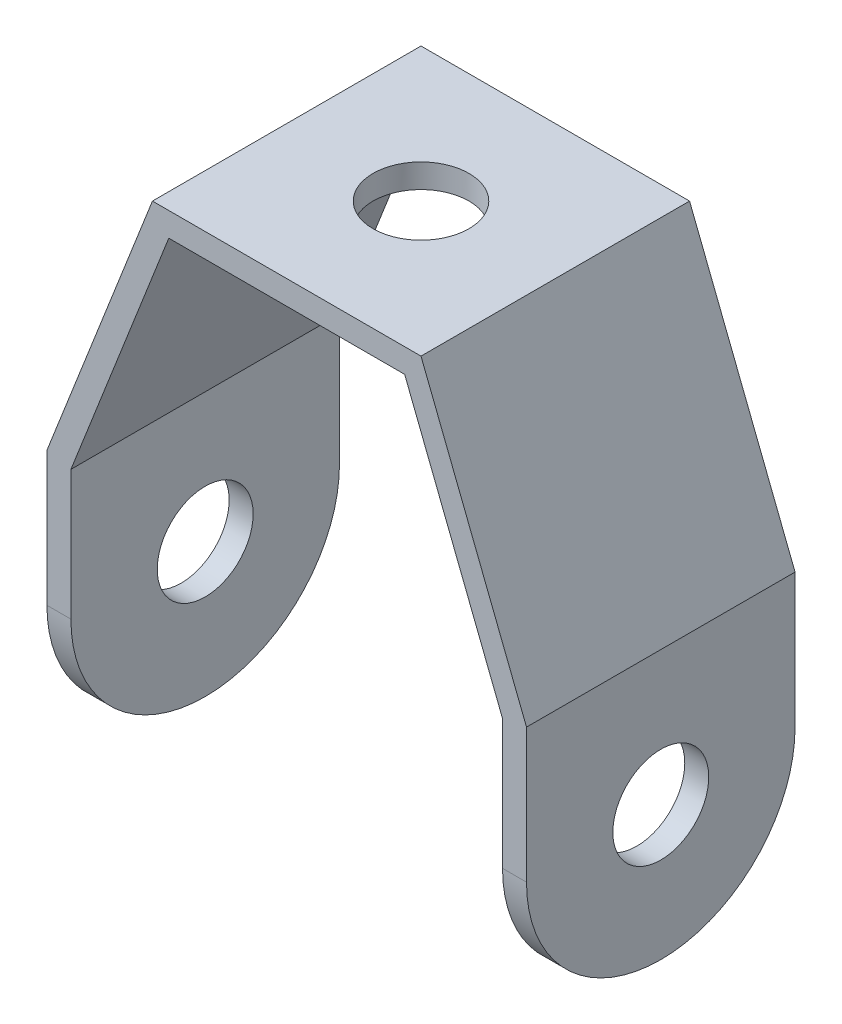
ISO-10303-21;
HEADER;
FILE_DESCRIPTION(('STEP AP214'),'2;1');
FILE_NAME('part.step','',(''),(''),'','','');
FILE_SCHEMA(('AUTOMOTIVE_DESIGN { 1 0 10303 214 1 1 1 1 }'));
ENDSEC;
DATA;
#1=APPLICATION_CONTEXT('core data for automotive mechanical design processes');
#2=APPLICATION_PROTOCOL_DEFINITION('international standard','automotive_design',2000,#1);
#3=PRODUCT_CONTEXT('',#1,'mechanical');
#4=PRODUCT('Part','Part','',(#3));
#5=PRODUCT_RELATED_PRODUCT_CATEGORY('part','',(#4));
#6=PRODUCT_DEFINITION_FORMATION('','',#4);
#7=PRODUCT_DEFINITION_CONTEXT('part definition',#1,'design');
#8=PRODUCT_DEFINITION('design','',#6,#7);
#9=PRODUCT_DEFINITION_SHAPE('','',#8);
#10=(LENGTH_UNIT() NAMED_UNIT(*) SI_UNIT(.MILLI.,.METRE.));
#11=(NAMED_UNIT(*) PLANE_ANGLE_UNIT() SI_UNIT($,.RADIAN.));
#12=(NAMED_UNIT(*) SI_UNIT($,.STERADIAN.) SOLID_ANGLE_UNIT());
#13=UNCERTAINTY_MEASURE_WITH_UNIT(LENGTH_MEASURE(1.E-05),#10,'distance_accuracy_value','');
#14=(GEOMETRIC_REPRESENTATION_CONTEXT(3) GLOBAL_UNCERTAINTY_ASSIGNED_CONTEXT((#13)) GLOBAL_UNIT_ASSIGNED_CONTEXT((#10,
#11,#12)) REPRESENTATION_CONTEXT('',''));
#15=CARTESIAN_POINT('',(0.,0.,0.));
#16=DIRECTION('',(0.,0.,1.));
#17=DIRECTION('',(1.,0.,0.));
#18=AXIS2_PLACEMENT_3D('',#15,#16,#17);
#19=CARTESIAN_POINT('',(0.,0.,28.));
#20=DIRECTION('',(0.,0.,1.));
#21=DIRECTION('',(1.,0.,0.));
#22=AXIS2_PLACEMENT_3D('',#19,#20,#21);
#23=PLANE('',#22);
#24=DIRECTION('',(0.,1.,0.));
#25=VECTOR('',#24,1.);
#26=CARTESIAN_POINT('',(22.5,0.,28.));
#27=LINE('',#26,#25);
#28=CARTESIAN_POINT('',(22.5,-14.,28.));
#29=VERTEX_POINT('',#28);
#30=CARTESIAN_POINT('',(22.5,-0.473458616586979,28.));
#31=VERTEX_POINT('',#30);
#32=EDGE_CURVE('E275',#29,#31,#27,.T.);
#33=ORIENTED_EDGE('',*,*,#32,.F.);
#34=DIRECTION('',(1.,0.,0.));
#35=VECTOR('',#34,1.);
#36=CARTESIAN_POINT('',(25.,-14.,28.));
#37=LINE('',#36,#35);
#38=CARTESIAN_POINT('',(25.,-14.,28.));
#39=VERTEX_POINT('',#38);
#40=EDGE_CURVE('E255',#29,#39,#37,.T.);
#41=ORIENTED_EDGE('',*,*,#40,.T.);
#42=DIRECTION('',(0.,1.,0.));
#43=VECTOR('',#42,1.);
#44=CARTESIAN_POINT('',(25.,28.,28.));
#45=LINE('',#44,#43);
#46=CARTESIAN_POINT('',(25.,0.,28.));
#47=VERTEX_POINT('',#46);
#48=EDGE_CURVE('E214',#39,#47,#45,.T.);
#49=ORIENTED_EDGE('',*,*,#48,.T.);
#50=DIRECTION('',(0.365652372422993,-0.930751493440347,0.));
#51=VECTOR('',#50,1.);
#52=CARTESIAN_POINT('',(21.6574585635359,8.50828729281768,28.));
#53=LINE('',#52,#51);
#54=CARTESIAN_POINT('',(14.,28.,28.));
#55=VERTEX_POINT('',#54);
#56=EDGE_CURVE('E307',#55,#47,#53,.T.);
#57=ORIENTED_EDGE('',*,*,#56,.F.);
#58=DIRECTION('',(-1.,0.,0.));
#59=VECTOR('',#58,1.);
#60=CARTESIAN_POINT('',(-25.,28.,28.));
#61=LINE('',#60,#59);
#62=CARTESIAN_POINT('',(-14.,28.,28.));
#63=VERTEX_POINT('',#62);
#64=EDGE_CURVE('E200',#55,#63,#61,.T.);
#65=ORIENTED_EDGE('',*,*,#64,.T.);
#66=DIRECTION('',(0.365652372422994,0.930751493440347,0.));
#67=VECTOR('',#66,1.);
#68=CARTESIAN_POINT('',(-21.6574585635359,8.50828729281769,28.));
#69=LINE('',#68,#67);
#70=CARTESIAN_POINT('',(-25.,0.,28.));
#71=VERTEX_POINT('',#70);
#72=EDGE_CURVE('E181',#71,#63,#69,.T.);
#73=ORIENTED_EDGE('',*,*,#72,.F.);
#74=DIRECTION('',(0.,-1.,0.));
#75=VECTOR('',#74,1.);
#76=CARTESIAN_POINT('',(-25.,28.,28.));
#77=LINE('',#76,#75);
#78=CARTESIAN_POINT('',(-25.,-14.,28.));
#79=VERTEX_POINT('',#78);
#80=EDGE_CURVE('E196',#71,#79,#77,.T.);
#81=ORIENTED_EDGE('',*,*,#80,.T.);
#82=DIRECTION('',(1.,0.,0.));
#83=VECTOR('',#82,1.);
#84=CARTESIAN_POINT('',(-22.5,-14.,28.));
#85=LINE('',#84,#83);
#86=CARTESIAN_POINT('',(-22.5,-14.,28.));
#87=VERTEX_POINT('',#86);
#88=EDGE_CURVE('E252',#79,#87,#85,.T.);
#89=ORIENTED_EDGE('',*,*,#88,.T.);
#90=DIRECTION('',(0.,1.,0.));
#91=VECTOR('',#90,1.);
#92=CARTESIAN_POINT('',(-22.5,0.,28.));
#93=LINE('',#92,#91);
#94=CARTESIAN_POINT('',(-22.5,-0.473458616586937,28.));
#95=VERTEX_POINT('',#94);
#96=EDGE_CURVE('E286',#87,#95,#93,.T.);
#97=ORIENTED_EDGE('',*,*,#96,.T.);
#98=DIRECTION('',(-0.365652372422994,-0.930751493440347,0.));
#99=VECTOR('',#98,1.);
#100=CARTESIAN_POINT('',(-19.3305798299351,7.5941563617602,28.));
#101=LINE('',#100,#99);
#102=CARTESIAN_POINT('',(-12.2961412577694,25.5,28.));
#103=VERTEX_POINT('',#102);
#104=EDGE_CURVE('E332',#103,#95,#101,.T.);
#105=ORIENTED_EDGE('',*,*,#104,.F.);
#106=DIRECTION('',(1.,0.,0.));
#107=VECTOR('',#106,1.);
#108=CARTESIAN_POINT('',(0.,25.5,28.));
#109=LINE('',#108,#107);
#110=CARTESIAN_POINT('',(12.2961412577694,25.5,28.));
#111=VERTEX_POINT('',#110);
#112=EDGE_CURVE('E329',#103,#111,#109,.T.);
#113=ORIENTED_EDGE('',*,*,#112,.T.);
#114=DIRECTION('',(0.365652372422993,-0.930751493440347,0.));
#115=VECTOR('',#114,1.);
#116=CARTESIAN_POINT('',(19.330579829935,7.59415636176019,28.));
#117=LINE('',#116,#115);
#118=EDGE_CURVE('E284',#111,#31,#117,.T.);
#119=ORIENTED_EDGE('',*,*,#118,.T.);
#120=EDGE_LOOP('',(#33,#41,#49,#57,#65,#73,#81,#89,#97,#105,#113,#119));
#121=FACE_BOUND('',#120,.T.);
#122=ADVANCED_FACE('F77',(#121),#23,.T.);
#123=CARTESIAN_POINT('',(0.,0.,0.));
#124=DIRECTION('',(0.,0.,1.));
#125=DIRECTION('',(1.,0.,0.));
#126=AXIS2_PLACEMENT_3D('',#123,#124,#125);
#127=PLANE('',#126);
#128=DIRECTION('',(0.,1.,0.));
#129=VECTOR('',#128,1.);
#130=CARTESIAN_POINT('',(25.,28.,0.));
#131=LINE('',#130,#129);
#132=CARTESIAN_POINT('',(25.,-14.,0.));
#133=VERTEX_POINT('',#132);
#134=CARTESIAN_POINT('',(25.,0.,0.));
#135=VERTEX_POINT('',#134);
#136=EDGE_CURVE('E218',#133,#135,#131,.T.);
#137=ORIENTED_EDGE('',*,*,#136,.F.);
#138=DIRECTION('',(1.,0.,0.));
#139=VECTOR('',#138,1.);
#140=CARTESIAN_POINT('',(0.,-14.,0.));
#141=LINE('',#140,#139);
#142=CARTESIAN_POINT('',(22.5,-14.,0.));
#143=VERTEX_POINT('',#142);
#144=EDGE_CURVE('E12',#133,#143,#141,.F.);
#145=ORIENTED_EDGE('',*,*,#144,.T.);
#146=DIRECTION('',(0.,1.,0.));
#147=VECTOR('',#146,1.);
#148=CARTESIAN_POINT('',(22.5,0.,0.));
#149=LINE('',#148,#147);
#150=CARTESIAN_POINT('',(22.5,-0.473458616586979,0.));
#151=VERTEX_POINT('',#150);
#152=EDGE_CURVE('E339',#143,#151,#149,.T.);
#153=ORIENTED_EDGE('',*,*,#152,.T.);
#154=DIRECTION('',(0.365652372422993,-0.930751493440347,0.));
#155=VECTOR('',#154,1.);
#156=CARTESIAN_POINT('',(19.330579829935,7.59415636176019,0.));
#157=LINE('',#156,#155);
#158=CARTESIAN_POINT('',(12.2961412577694,25.5,0.));
#159=VERTEX_POINT('',#158);
#160=EDGE_CURVE('E342',#159,#151,#157,.T.);
#161=ORIENTED_EDGE('',*,*,#160,.F.);
#162=DIRECTION('',(1.,0.,0.));
#163=VECTOR('',#162,1.);
#164=CARTESIAN_POINT('',(0.,25.5,0.));
#165=LINE('',#164,#163);
#166=CARTESIAN_POINT('',(-12.2961412577694,25.5,0.));
#167=VERTEX_POINT('',#166);
#168=EDGE_CURVE('E346',#167,#159,#165,.T.);
#169=ORIENTED_EDGE('',*,*,#168,.F.);
#170=DIRECTION('',(-0.365652372422994,-0.930751493440347,0.));
#171=VECTOR('',#170,1.);
#172=CARTESIAN_POINT('',(-19.3305798299351,7.5941563617602,0.));
#173=LINE('',#172,#171);
#174=CARTESIAN_POINT('',(-22.5,-0.473458616586937,0.));
#175=VERTEX_POINT('',#174);
#176=EDGE_CURVE('E349',#167,#175,#173,.T.);
#177=ORIENTED_EDGE('',*,*,#176,.T.);
#178=DIRECTION('',(0.,1.,0.));
#179=VECTOR('',#178,1.);
#180=CARTESIAN_POINT('',(-22.5,0.,0.));
#181=LINE('',#180,#179);
#182=CARTESIAN_POINT('',(-22.5,-14.,0.));
#183=VERTEX_POINT('',#182);
#184=EDGE_CURVE('E336',#183,#175,#181,.T.);
#185=ORIENTED_EDGE('',*,*,#184,.F.);
#186=DIRECTION('',(1.,0.,0.));
#187=VECTOR('',#186,1.);
#188=CARTESIAN_POINT('',(0.,-14.,0.));
#189=LINE('',#188,#187);
#190=CARTESIAN_POINT('',(-25.,-14.,0.));
#191=VERTEX_POINT('',#190);
#192=EDGE_CURVE('E243',#183,#191,#189,.F.);
#193=ORIENTED_EDGE('',*,*,#192,.T.);
#194=DIRECTION('',(0.,-1.,0.));
#195=VECTOR('',#194,1.);
#196=CARTESIAN_POINT('',(-25.,28.,0.));
#197=LINE('',#196,#195);
#198=CARTESIAN_POINT('',(-25.,0.,0.));
#199=VERTEX_POINT('',#198);
#200=EDGE_CURVE('E226',#199,#191,#197,.T.);
#201=ORIENTED_EDGE('',*,*,#200,.F.);
#202=DIRECTION('',(-0.365652372422994,-0.930751493440347,0.));
#203=VECTOR('',#202,1.);
#204=CARTESIAN_POINT('',(-21.6574585635359,8.50828729281769,0.));
#205=LINE('',#204,#203);
#206=CARTESIAN_POINT('',(-14.,28.,0.));
#207=VERTEX_POINT('',#206);
#208=EDGE_CURVE('E184',#207,#199,#205,.T.);
#209=ORIENTED_EDGE('',*,*,#208,.F.);
#210=DIRECTION('',(-1.,0.,0.));
#211=VECTOR('',#210,1.);
#212=CARTESIAN_POINT('',(-25.,28.,0.));
#213=LINE('',#212,#211);
#214=CARTESIAN_POINT('',(14.,28.,0.));
#215=VERTEX_POINT('',#214);
#216=EDGE_CURVE('E221',#215,#207,#213,.T.);
#217=ORIENTED_EDGE('',*,*,#216,.F.);
#218=DIRECTION('',(-0.365652372422993,0.930751493440347,0.));
#219=VECTOR('',#218,1.);
#220=CARTESIAN_POINT('',(21.6574585635359,8.50828729281768,0.));
#221=LINE('',#220,#219);
#222=EDGE_CURVE('E322',#135,#215,#221,.T.);
#223=ORIENTED_EDGE('',*,*,#222,.F.);
#224=EDGE_LOOP('',(#137,#145,#153,#161,#169,#177,#185,#193,#201,#209,#217,#223));
#225=FACE_BOUND('',#224,.T.);
#226=ADVANCED_FACE('F369',(#225),#127,.F.);
#227=CARTESIAN_POINT('',(25.,28.,28.));
#228=DIRECTION('',(-1.,0.,0.));
#229=DIRECTION('',(0.,-1.,0.));
#230=AXIS2_PLACEMENT_3D('',#227,#228,#229);
#231=PLANE('',#230);
#232=CARTESIAN_POINT('',(25.,-14.,14.));
#233=DIRECTION('',(-1.,0.,0.));
#234=DIRECTION('',(0.,-1.,0.));
#235=AXIS2_PLACEMENT_3D('',#232,#233,#234);
#236=CIRCLE('',#235,5.);
#237=CARTESIAN_POINT('',(25.,-19.,14.));
#238=VERTEX_POINT('',#237);
#239=EDGE_CURVE('E234',#238,#238,#236,.T.);
#240=ORIENTED_EDGE('',*,*,#239,.T.);
#241=EDGE_LOOP('',(#240));
#242=FACE_BOUND('',#241,.T.);
#243=ORIENTED_EDGE('',*,*,#48,.F.);
#244=CARTESIAN_POINT('',(25.,-14.,14.));
#245=DIRECTION('',(-1.,0.,0.));
#246=DIRECTION('',(0.,-1.,0.));
#247=AXIS2_PLACEMENT_3D('',#244,#245,#246);
#248=CIRCLE('',#247,14.);
#249=CARTESIAN_POINT('',(25.,-28.,14.));
#250=VERTEX_POINT('',#249);
#251=EDGE_CURVE('E266',#39,#250,#248,.F.);
#252=ORIENTED_EDGE('',*,*,#251,.T.);
#253=CARTESIAN_POINT('',(25.,-14.,14.));
#254=DIRECTION('',(-1.,0.,0.));
#255=DIRECTION('',(0.,-1.,0.));
#256=AXIS2_PLACEMENT_3D('',#253,#254,#255);
#257=CIRCLE('',#256,14.);
#258=EDGE_CURVE('E263',#250,#133,#257,.F.);
#259=ORIENTED_EDGE('',*,*,#258,.T.);
#260=ORIENTED_EDGE('',*,*,#136,.T.);
#261=DIRECTION('',(0.,0.,-1.));
#262=VECTOR('',#261,1.);
#263=CARTESIAN_POINT('',(25.,0.,28.));
#264=LINE('',#263,#262);
#265=EDGE_CURVE('E311',#47,#135,#264,.T.);
#266=ORIENTED_EDGE('',*,*,#265,.F.);
#267=EDGE_LOOP('',(#243,#252,#259,#260,#266));
#268=FACE_BOUND('',#267,.T.);
#269=ADVANCED_FACE('F291',(#242,#268),#231,.F.);
#270=CARTESIAN_POINT('',(-25.,28.,28.));
#271=DIRECTION('',(0.,-1.,0.));
#272=DIRECTION('',(0.,0.,-1.));
#273=AXIS2_PLACEMENT_3D('',#270,#271,#272);
#274=PLANE('',#273);
#275=CARTESIAN_POINT('',(0.,28.,14.));
#276=DIRECTION('',(0.,1.,0.));
#277=DIRECTION('',(0.,0.,1.));
#278=AXIS2_PLACEMENT_3D('',#275,#276,#277);
#279=CIRCLE('',#278,5.);
#280=CARTESIAN_POINT('',(0.,28.,19.));
#281=VERTEX_POINT('',#280);
#282=EDGE_CURVE('E239',#281,#281,#279,.T.);
#283=ORIENTED_EDGE('',*,*,#282,.F.);
#284=EDGE_LOOP('',(#283));
#285=FACE_BOUND('',#284,.T.);
#286=DIRECTION('',(0.,0.,-1.));
#287=VECTOR('',#286,1.);
#288=CARTESIAN_POINT('',(-14.,28.,28.));
#289=LINE('',#288,#287);
#290=EDGE_CURVE('E190',#63,#207,#289,.T.);
#291=ORIENTED_EDGE('',*,*,#290,.F.);
#292=ORIENTED_EDGE('',*,*,#64,.F.);
#293=DIRECTION('',(0.,0.,-1.));
#294=VECTOR('',#293,1.);
#295=CARTESIAN_POINT('',(14.,28.,28.));
#296=LINE('',#295,#294);
#297=EDGE_CURVE('E202',#55,#215,#296,.T.);
#298=ORIENTED_EDGE('',*,*,#297,.T.);
#299=ORIENTED_EDGE('',*,*,#216,.T.);
#300=EDGE_LOOP('',(#291,#292,#298,#299));
#301=FACE_BOUND('',#300,.T.);
#302=ADVANCED_FACE('F372',(#285,#301),#274,.F.);
#303=CARTESIAN_POINT('',(-25.,28.,28.));
#304=DIRECTION('',(1.,0.,0.));
#305=DIRECTION('',(0.,1.,0.));
#306=AXIS2_PLACEMENT_3D('',#303,#304,#305);
#307=PLANE('',#306);
#308=CARTESIAN_POINT('',(-25.,-14.,14.));
#309=DIRECTION('',(-1.,0.,0.));
#310=DIRECTION('',(0.,-1.,0.));
#311=AXIS2_PLACEMENT_3D('',#308,#309,#310);
#312=CIRCLE('',#311,5.);
#313=CARTESIAN_POINT('',(-25.,-19.,14.));
#314=VERTEX_POINT('',#313);
#315=EDGE_CURVE('E238',#314,#314,#312,.T.);
#316=ORIENTED_EDGE('',*,*,#315,.F.);
#317=EDGE_LOOP('',(#316));
#318=FACE_BOUND('',#317,.T.);
#319=ORIENTED_EDGE('',*,*,#200,.T.);
#320=CARTESIAN_POINT('',(-25.,-14.,14.));
#321=DIRECTION('',(1.,0.,0.));
#322=DIRECTION('',(0.,1.,0.));
#323=AXIS2_PLACEMENT_3D('',#320,#321,#322);
#324=CIRCLE('',#323,14.);
#325=CARTESIAN_POINT('',(-25.,-28.,14.));
#326=VERTEX_POINT('',#325);
#327=EDGE_CURVE('E249',#191,#326,#324,.F.);
#328=ORIENTED_EDGE('',*,*,#327,.T.);
#329=CARTESIAN_POINT('',(-25.,-14.,14.));
#330=DIRECTION('',(1.,0.,0.));
#331=DIRECTION('',(0.,1.,0.));
#332=AXIS2_PLACEMENT_3D('',#329,#330,#331);
#333=CIRCLE('',#332,14.);
#334=EDGE_CURVE('E206',#326,#79,#333,.F.);
#335=ORIENTED_EDGE('',*,*,#334,.T.);
#336=ORIENTED_EDGE('',*,*,#80,.F.);
#337=DIRECTION('',(0.,0.,-1.));
#338=VECTOR('',#337,1.);
#339=CARTESIAN_POINT('',(-25.,0.,28.));
#340=LINE('',#339,#338);
#341=EDGE_CURVE('E178',#71,#199,#340,.T.);
#342=ORIENTED_EDGE('',*,*,#341,.T.);
#343=EDGE_LOOP('',(#319,#328,#335,#336,#342));
#344=FACE_BOUND('',#343,.T.);
#345=ADVANCED_FACE('F204',(#318,#344),#307,.F.);
#346=CARTESIAN_POINT('',(-19.3305798299351,7.5941563617602,0.));
#347=DIRECTION('',(-0.930751493440347,0.365652372422994,0.));
#348=DIRECTION('',(-0.365652372422994,-0.930751493440347,0.));
#349=AXIS2_PLACEMENT_3D('',#346,#347,#348);
#350=PLANE('',#349);
#351=ORIENTED_EDGE('',*,*,#104,.T.);
#352=DIRECTION('',(0.,0.,1.));
#353=VECTOR('',#352,1.);
#354=CARTESIAN_POINT('',(-22.5,-0.473458616586937,0.));
#355=LINE('',#354,#353);
#356=EDGE_CURVE('E222',#175,#95,#355,.T.);
#357=ORIENTED_EDGE('',*,*,#356,.F.);
#358=ORIENTED_EDGE('',*,*,#176,.F.);
#359=DIRECTION('',(0.,0.,1.));
#360=VECTOR('',#359,1.);
#361=CARTESIAN_POINT('',(-12.2961412577694,25.5,0.));
#362=LINE('',#361,#360);
#363=EDGE_CURVE('E359',#167,#103,#362,.T.);
#364=ORIENTED_EDGE('',*,*,#363,.T.);
#365=EDGE_LOOP('',(#351,#357,#358,#364));
#366=FACE_BOUND('',#365,.T.);
#367=ADVANCED_FACE('F390',(#366),#350,.F.);
#368=CARTESIAN_POINT('',(-22.5,0.,0.));
#369=DIRECTION('',(1.,0.,0.));
#370=DIRECTION('',(0.,0.,-1.));
#371=AXIS2_PLACEMENT_3D('',#368,#369,#370);
#372=PLANE('',#371);
#373=CARTESIAN_POINT('',(-22.5,-14.,14.));
#374=DIRECTION('',(1.,0.,0.));
#375=DIRECTION('',(0.,0.,-1.));
#376=AXIS2_PLACEMENT_3D('',#373,#374,#375);
#377=CIRCLE('',#376,5.);
#378=CARTESIAN_POINT('',(-22.5,-14.,9.));
#379=VERTEX_POINT('',#378);
#380=EDGE_CURVE('E233',#379,#379,#377,.T.);
#381=ORIENTED_EDGE('',*,*,#380,.F.);
#382=EDGE_LOOP('',(#381));
#383=FACE_BOUND('',#382,.T.);
#384=CARTESIAN_POINT('',(-22.5,-14.,14.));
#385=DIRECTION('',(1.,0.,0.));
#386=DIRECTION('',(0.,0.,-1.));
#387=AXIS2_PLACEMENT_3D('',#384,#385,#386);
#388=CIRCLE('',#387,14.);
#389=CARTESIAN_POINT('',(-22.5,-28.,14.));
#390=VERTEX_POINT('',#389);
#391=EDGE_CURVE('E208',#87,#390,#388,.T.);
#392=ORIENTED_EDGE('',*,*,#391,.T.);
#393=CARTESIAN_POINT('',(-22.5,-14.,14.));
#394=DIRECTION('',(1.,0.,0.));
#395=DIRECTION('',(0.,0.,-1.));
#396=AXIS2_PLACEMENT_3D('',#393,#394,#395);
#397=CIRCLE('',#396,14.);
#398=EDGE_CURVE('E212',#390,#183,#397,.T.);
#399=ORIENTED_EDGE('',*,*,#398,.T.);
#400=ORIENTED_EDGE('',*,*,#184,.T.);
#401=ORIENTED_EDGE('',*,*,#356,.T.);
#402=ORIENTED_EDGE('',*,*,#96,.F.);
#403=EDGE_LOOP('',(#392,#399,#400,#401,#402));
#404=FACE_BOUND('',#403,.T.);
#405=ADVANCED_FACE('F383',(#383,#404),#372,.T.);
#406=CARTESIAN_POINT('',(22.5,0.,0.));
#407=DIRECTION('',(1.,0.,0.));
#408=DIRECTION('',(0.,0.,-1.));
#409=AXIS2_PLACEMENT_3D('',#406,#407,#408);
#410=PLANE('',#409);
#411=CARTESIAN_POINT('',(22.5,-14.,14.));
#412=DIRECTION('',(1.,0.,0.));
#413=DIRECTION('',(0.,0.,-1.));
#414=AXIS2_PLACEMENT_3D('',#411,#412,#413);
#415=CIRCLE('',#414,5.);
#416=CARTESIAN_POINT('',(22.5,-14.,9.));
#417=VERTEX_POINT('',#416);
#418=EDGE_CURVE('E229',#417,#417,#415,.T.);
#419=ORIENTED_EDGE('',*,*,#418,.T.);
#420=EDGE_LOOP('',(#419));
#421=FACE_BOUND('',#420,.T.);
#422=CARTESIAN_POINT('',(22.5,-14.,14.));
#423=DIRECTION('',(1.,0.,0.));
#424=DIRECTION('',(0.,0.,-1.));
#425=AXIS2_PLACEMENT_3D('',#422,#423,#424);
#426=CIRCLE('',#425,14.);
#427=CARTESIAN_POINT('',(22.5,-28.,14.));
#428=VERTEX_POINT('',#427);
#429=EDGE_CURVE('E94',#143,#428,#426,.F.);
#430=ORIENTED_EDGE('',*,*,#429,.T.);
#431=CARTESIAN_POINT('',(22.5,-14.,14.));
#432=DIRECTION('',(1.,0.,0.));
#433=DIRECTION('',(0.,0.,-1.));
#434=AXIS2_PLACEMENT_3D('',#431,#432,#433);
#435=CIRCLE('',#434,14.);
#436=EDGE_CURVE('E87',#428,#29,#435,.F.);
#437=ORIENTED_EDGE('',*,*,#436,.T.);
#438=ORIENTED_EDGE('',*,*,#32,.T.);
#439=DIRECTION('',(0.,0.,1.));
#440=VECTOR('',#439,1.);
#441=CARTESIAN_POINT('',(22.5,-0.473458616586979,0.));
#442=LINE('',#441,#440);
#443=EDGE_CURVE('E353',#151,#31,#442,.T.);
#444=ORIENTED_EDGE('',*,*,#443,.F.);
#445=ORIENTED_EDGE('',*,*,#152,.F.);
#446=EDGE_LOOP('',(#430,#437,#438,#444,#445));
#447=FACE_BOUND('',#446,.T.);
#448=ADVANCED_FACE('F273',(#421,#447),#410,.F.);
#449=CARTESIAN_POINT('',(19.330579829935,7.59415636176019,0.));
#450=DIRECTION('',(-0.930751493440347,-0.365652372422993,0.));
#451=DIRECTION('',(0.365652372422993,-0.930751493440347,0.));
#452=AXIS2_PLACEMENT_3D('',#449,#450,#451);
#453=PLANE('',#452);
#454=ORIENTED_EDGE('',*,*,#118,.F.);
#455=DIRECTION('',(0.,0.,1.));
#456=VECTOR('',#455,1.);
#457=CARTESIAN_POINT('',(12.2961412577694,25.5,0.));
#458=LINE('',#457,#456);
#459=EDGE_CURVE('E356',#159,#111,#458,.T.);
#460=ORIENTED_EDGE('',*,*,#459,.F.);
#461=ORIENTED_EDGE('',*,*,#160,.T.);
#462=ORIENTED_EDGE('',*,*,#443,.T.);
#463=EDGE_LOOP('',(#454,#460,#461,#462));
#464=FACE_BOUND('',#463,.T.);
#465=ADVANCED_FACE('F397',(#464),#453,.T.);
#466=CARTESIAN_POINT('',(0.,25.5,0.));
#467=DIRECTION('',(0.,-1.,0.));
#468=DIRECTION('',(0.,0.,-1.));
#469=AXIS2_PLACEMENT_3D('',#466,#467,#468);
#470=PLANE('',#469);
#471=CARTESIAN_POINT('',(0.,25.5,14.));
#472=DIRECTION('',(0.,-1.,0.));
#473=DIRECTION('',(0.,0.,-1.));
#474=AXIS2_PLACEMENT_3D('',#471,#472,#473);
#475=CIRCLE('',#474,5.);
#476=CARTESIAN_POINT('',(0.,25.5,9.));
#477=VERTEX_POINT('',#476);
#478=EDGE_CURVE('E235',#477,#477,#475,.T.);
#479=ORIENTED_EDGE('',*,*,#478,.F.);
#480=EDGE_LOOP('',(#479));
#481=FACE_BOUND('',#480,.T.);
#482=ORIENTED_EDGE('',*,*,#112,.F.);
#483=ORIENTED_EDGE('',*,*,#363,.F.);
#484=ORIENTED_EDGE('',*,*,#168,.T.);
#485=ORIENTED_EDGE('',*,*,#459,.T.);
#486=EDGE_LOOP('',(#482,#483,#484,#485));
#487=FACE_BOUND('',#486,.T.);
#488=ADVANCED_FACE('F393',(#481,#487),#470,.T.);
#489=CARTESIAN_POINT('',(-21.6574585635359,8.50828729281769,28.));
#490=DIRECTION('',(-0.930751493440347,0.365652372422994,0.));
#491=DIRECTION('',(-0.365652372422994,-0.930751493440347,0.));
#492=AXIS2_PLACEMENT_3D('',#489,#490,#491);
#493=PLANE('',#492);
#494=ORIENTED_EDGE('',*,*,#208,.T.);
#495=ORIENTED_EDGE('',*,*,#341,.F.);
#496=ORIENTED_EDGE('',*,*,#72,.T.);
#497=ORIENTED_EDGE('',*,*,#290,.T.);
#498=EDGE_LOOP('',(#494,#495,#496,#497));
#499=FACE_BOUND('',#498,.T.);
#500=ADVANCED_FACE('F180',(#499),#493,.T.);
#501=CARTESIAN_POINT('',(21.6574585635359,8.50828729281768,28.));
#502=DIRECTION('',(0.930751493440347,0.365652372422993,0.));
#503=DIRECTION('',(-0.365652372422993,0.930751493440347,0.));
#504=AXIS2_PLACEMENT_3D('',#501,#502,#503);
#505=PLANE('',#504);
#506=ORIENTED_EDGE('',*,*,#222,.T.);
#507=ORIENTED_EDGE('',*,*,#297,.F.);
#508=ORIENTED_EDGE('',*,*,#56,.T.);
#509=ORIENTED_EDGE('',*,*,#265,.T.);
#510=EDGE_LOOP('',(#506,#507,#508,#509));
#511=FACE_BOUND('',#510,.T.);
#512=ADVANCED_FACE('F367',(#511),#505,.T.);
#513=CARTESIAN_POINT('',(25.,-14.,14.));
#514=DIRECTION('',(-1.,0.,0.));
#515=DIRECTION('',(0.,-1.,0.));
#516=AXIS2_PLACEMENT_3D('',#513,#514,#515);
#517=CYLINDRICAL_SURFACE('',#516,5.);
#518=ORIENTED_EDGE('',*,*,#239,.F.);
#519=EDGE_LOOP('',(#518));
#520=FACE_BOUND('',#519,.T.);
#521=ORIENTED_EDGE('',*,*,#418,.F.);
#522=EDGE_LOOP('',(#521));
#523=FACE_BOUND('',#522,.T.);
#524=ADVANCED_FACE('F460',(#520,#523),#517,.F.);
#525=ORIENTED_EDGE('',*,*,#380,.T.);
#526=EDGE_LOOP('',(#525));
#527=FACE_BOUND('',#526,.T.);
#528=ORIENTED_EDGE('',*,*,#315,.T.);
#529=EDGE_LOOP('',(#528));
#530=FACE_BOUND('',#529,.T.);
#531=ADVANCED_FACE('F452',(#527,#530),#517,.F.);
#532=CARTESIAN_POINT('',(0.,-28.,14.));
#533=DIRECTION('',(0.,1.,0.));
#534=DIRECTION('',(0.,0.,1.));
#535=AXIS2_PLACEMENT_3D('',#532,#533,#534);
#536=CYLINDRICAL_SURFACE('',#535,5.);
#537=ORIENTED_EDGE('',*,*,#478,.T.);
#538=EDGE_LOOP('',(#537));
#539=FACE_BOUND('',#538,.T.);
#540=ORIENTED_EDGE('',*,*,#282,.T.);
#541=EDGE_LOOP('',(#540));
#542=FACE_BOUND('',#541,.T.);
#543=ADVANCED_FACE('F431',(#539,#542),#536,.F.);
#544=CARTESIAN_POINT('',(0.,-14.,14.));
#545=DIRECTION('',(-1.,0.,0.));
#546=DIRECTION('',(0.,0.,1.));
#547=AXIS2_PLACEMENT_3D('',#544,#545,#546);
#548=CYLINDRICAL_SURFACE('',#547,14.);
#549=ORIENTED_EDGE('',*,*,#88,.F.);
#550=ORIENTED_EDGE('',*,*,#334,.F.);
#551=DIRECTION('',(1.,0.,0.));
#552=VECTOR('',#551,1.);
#553=CARTESIAN_POINT('',(-25.,-28.,14.));
#554=LINE('',#553,#552);
#555=EDGE_CURVE('E256',#390,#326,#554,.F.);
#556=ORIENTED_EDGE('',*,*,#555,.F.);
#557=ORIENTED_EDGE('',*,*,#391,.F.);
#558=EDGE_LOOP('',(#549,#550,#556,#557));
#559=FACE_BOUND('',#558,.T.);
#560=ADVANCED_FACE('F378',(#559),#548,.T.);
#561=CARTESIAN_POINT('',(-25.,-14.,14.));
#562=DIRECTION('',(1.,0.,0.));
#563=DIRECTION('',(0.,0.,-1.));
#564=AXIS2_PLACEMENT_3D('',#561,#562,#563);
#565=CYLINDRICAL_SURFACE('',#564,14.);
#566=ORIENTED_EDGE('',*,*,#327,.F.);
#567=ORIENTED_EDGE('',*,*,#192,.F.);
#568=ORIENTED_EDGE('',*,*,#398,.F.);
#569=ORIENTED_EDGE('',*,*,#555,.T.);
#570=EDGE_LOOP('',(#566,#567,#568,#569));
#571=FACE_BOUND('',#570,.T.);
#572=ADVANCED_FACE('F381',(#571),#565,.T.);
#573=CARTESIAN_POINT('',(-25.,-14.,14.));
#574=DIRECTION('',(1.,0.,0.));
#575=DIRECTION('',(0.,0.,-1.));
#576=AXIS2_PLACEMENT_3D('',#573,#574,#575);
#577=CYLINDRICAL_SURFACE('',#576,14.);
#578=DIRECTION('',(1.,0.,0.));
#579=VECTOR('',#578,1.);
#580=CARTESIAN_POINT('',(-25.,-28.,14.));
#581=LINE('',#580,#579);
#582=EDGE_CURVE('E81',#428,#250,#581,.T.);
#583=ORIENTED_EDGE('',*,*,#582,.F.);
#584=ORIENTED_EDGE('',*,*,#429,.F.);
#585=ORIENTED_EDGE('',*,*,#144,.F.);
#586=ORIENTED_EDGE('',*,*,#258,.F.);
#587=EDGE_LOOP('',(#583,#584,#585,#586));
#588=FACE_BOUND('',#587,.T.);
#589=ADVANCED_FACE('F79',(#588),#577,.T.);
#590=CARTESIAN_POINT('',(0.,-14.,14.));
#591=DIRECTION('',(-1.,0.,0.));
#592=DIRECTION('',(0.,0.,1.));
#593=AXIS2_PLACEMENT_3D('',#590,#591,#592);
#594=CYLINDRICAL_SURFACE('',#593,14.);
#595=ORIENTED_EDGE('',*,*,#436,.F.);
#596=ORIENTED_EDGE('',*,*,#582,.T.);
#597=ORIENTED_EDGE('',*,*,#251,.F.);
#598=ORIENTED_EDGE('',*,*,#40,.F.);
#599=EDGE_LOOP('',(#595,#596,#597,#598));
#600=FACE_BOUND('',#599,.T.);
#601=ADVANCED_FACE('F288',(#600),#594,.T.);
#602=CLOSED_SHELL('',(#122,#226,#269,#302,#345,#367,#405,#448,#465,#488,#500,#512,#524,#531,
#543,#560,#572,#589,#601));
#603=MANIFOLD_SOLID_BREP('B2',#602);
#604=ADVANCED_BREP_SHAPE_REPRESENTATION('',(#18,#603),#14);
#605=SHAPE_DEFINITION_REPRESENTATION(#9,#604);
ENDSEC;
END-ISO-10303-21;
